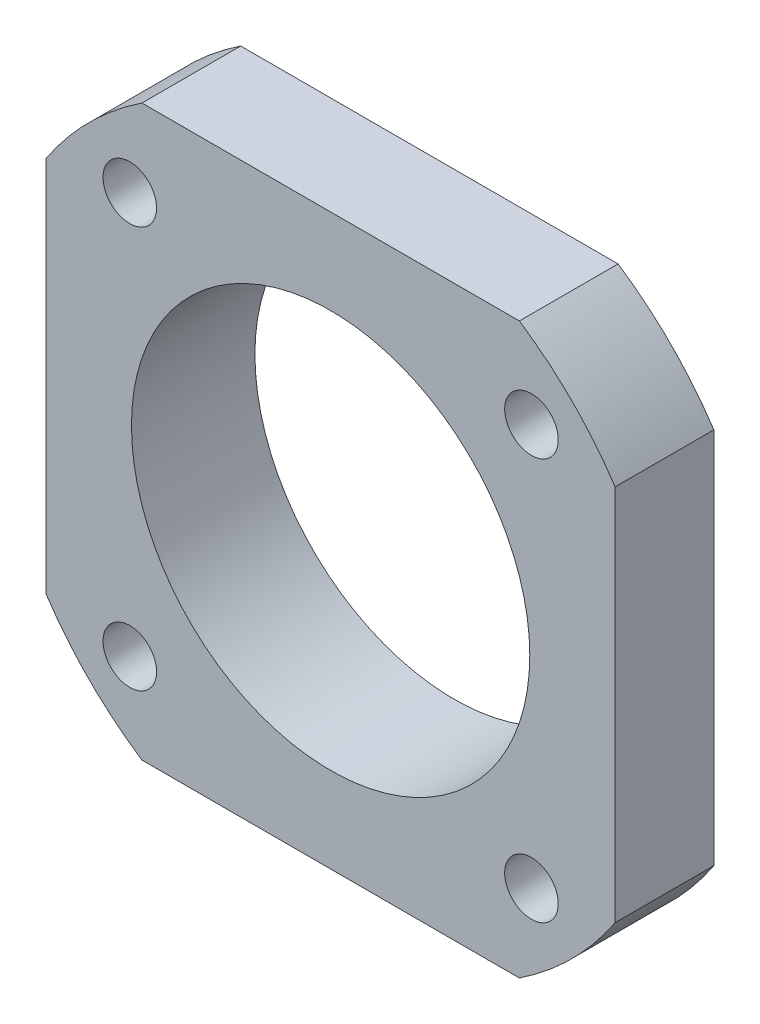
ISO-10303-21;
HEADER;
FILE_DESCRIPTION(('STEP AP214'),'2;1');
FILE_NAME('part.step','',(''),(''),'','','');
FILE_SCHEMA(('AUTOMOTIVE_DESIGN { 1 0 10303 214 1 1 1 1 }'));
ENDSEC;
DATA;
#1=APPLICATION_CONTEXT('core data for automotive mechanical design processes');
#2=APPLICATION_PROTOCOL_DEFINITION('international standard','automotive_design',2000,#1);
#3=PRODUCT_CONTEXT('',#1,'mechanical');
#4=PRODUCT('Part','Part','',(#3));
#5=PRODUCT_RELATED_PRODUCT_CATEGORY('part','',(#4));
#6=PRODUCT_DEFINITION_FORMATION('','',#4);
#7=PRODUCT_DEFINITION_CONTEXT('part definition',#1,'design');
#8=PRODUCT_DEFINITION('design','',#6,#7);
#9=PRODUCT_DEFINITION_SHAPE('','',#8);
#10=(LENGTH_UNIT() NAMED_UNIT(*) SI_UNIT(.MILLI.,.METRE.));
#11=(NAMED_UNIT(*) PLANE_ANGLE_UNIT() SI_UNIT($,.RADIAN.));
#12=(NAMED_UNIT(*) SI_UNIT($,.STERADIAN.) SOLID_ANGLE_UNIT());
#13=UNCERTAINTY_MEASURE_WITH_UNIT(LENGTH_MEASURE(1.E-05),#10,'distance_accuracy_value','');
#14=(GEOMETRIC_REPRESENTATION_CONTEXT(3) GLOBAL_UNCERTAINTY_ASSIGNED_CONTEXT((#13)) GLOBAL_UNIT_ASSIGNED_CONTEXT((#10,
#11,#12)) REPRESENTATION_CONTEXT('',''));
#15=CARTESIAN_POINT('',(0.,0.,0.));
#16=DIRECTION('',(0.,0.,1.));
#17=DIRECTION('',(1.,0.,0.));
#18=AXIS2_PLACEMENT_3D('',#15,#16,#17);
#19=CARTESIAN_POINT('',(0.,0.,-1.475));
#20=DIRECTION('',(0.,0.,1.));
#21=DIRECTION('',(1.,0.,0.));
#22=AXIS2_PLACEMENT_3D('',#19,#20,#21);
#23=CYLINDRICAL_SURFACE('',#22,12.75);
#24=CARTESIAN_POINT('',(0.,0.,-1.475));
#25=DIRECTION('',(0.,0.,1.));
#26=DIRECTION('',(1.,0.,0.));
#27=AXIS2_PLACEMENT_3D('',#24,#25,#26);
#28=CIRCLE('',#27,12.75);
#29=CARTESIAN_POINT('',(12.75,0.,-1.475));
#30=VERTEX_POINT('',#29);
#31=EDGE_CURVE('E19',#30,#30,#28,.F.);
#32=ORIENTED_EDGE('',*,*,#31,.F.);
#33=EDGE_LOOP('',(#32));
#34=FACE_BOUND('',#33,.T.);
#35=CARTESIAN_POINT('',(0.,0.,0.));
#36=DIRECTION('',(0.,0.,1.));
#37=DIRECTION('',(1.,0.,0.));
#38=AXIS2_PLACEMENT_3D('',#35,#36,#37);
#39=CIRCLE('',#38,12.75);
#40=CARTESIAN_POINT('',(12.75,0.,0.));
#41=VERTEX_POINT('',#40);
#42=EDGE_CURVE('E162',#41,#41,#39,.F.);
#43=ORIENTED_EDGE('',*,*,#42,.T.);
#44=EDGE_LOOP('',(#43));
#45=FACE_BOUND('',#44,.T.);
#46=ADVANCED_FACE('F16',(#34,#45),#23,.T.);
#47=CARTESIAN_POINT('',(0.,0.,-1.475));
#48=DIRECTION('',(0.,0.,-1.));
#49=DIRECTION('',(-1.,0.,0.));
#50=AXIS2_PLACEMENT_3D('',#47,#48,#49);
#51=PLANE('',#50);
#52=CARTESIAN_POINT('',(0.,0.,-1.475));
#53=DIRECTION('',(0.,0.,1.));
#54=DIRECTION('',(1.,0.,0.));
#55=AXIS2_PLACEMENT_3D('',#52,#53,#54);
#56=CIRCLE('',#55,11.9);
#57=CARTESIAN_POINT('',(11.9,0.,-1.475));
#58=VERTEX_POINT('',#57);
#59=EDGE_CURVE('E90',#58,#58,#56,.T.);
#60=ORIENTED_EDGE('',*,*,#59,.T.);
#61=EDGE_LOOP('',(#60));
#62=FACE_BOUND('',#61,.T.);
#63=ORIENTED_EDGE('',*,*,#31,.T.);
#64=EDGE_LOOP('',(#63));
#65=FACE_BOUND('',#64,.T.);
#66=ADVANCED_FACE('F169',(#62,#65),#51,.T.);
#67=CARTESIAN_POINT('',(0.,0.,0.));
#68=DIRECTION('',(0.,0.,1.));
#69=DIRECTION('',(1.,0.,0.));
#70=AXIS2_PLACEMENT_3D('',#67,#68,#69);
#71=PLANE('',#70);
#72=ORIENTED_EDGE('',*,*,#42,.F.);
#73=EDGE_LOOP('',(#72));
#74=FACE_BOUND('',#73,.T.);
#75=DIRECTION('',(1.,0.,0.));
#76=VECTOR('',#75,1.);
#77=CARTESIAN_POINT('',(11.2765242872084,-17.,0.));
#78=LINE('',#77,#76);
#79=CARTESIAN_POINT('',(11.2765242872083,-17.,0.));
#80=VERTEX_POINT('',#79);
#81=CARTESIAN_POINT('',(-11.2765242872084,-17.,0.));
#82=VERTEX_POINT('',#81);
#83=EDGE_CURVE('E84',#80,#82,#78,.F.);
#84=ORIENTED_EDGE('',*,*,#83,.T.);
#85=CARTESIAN_POINT('',(0.,0.,0.));
#86=DIRECTION('',(0.,0.,-1.));
#87=DIRECTION('',(-1.,0.,0.));
#88=AXIS2_PLACEMENT_3D('',#85,#86,#87);
#89=CIRCLE('',#88,20.4);
#90=CARTESIAN_POINT('',(-17.,-11.2765242872084,0.));
#91=VERTEX_POINT('',#90);
#92=EDGE_CURVE('E111',#91,#82,#89,.F.);
#93=ORIENTED_EDGE('',*,*,#92,.F.);
#94=DIRECTION('',(0.,1.,0.));
#95=VECTOR('',#94,1.);
#96=CARTESIAN_POINT('',(-17.,-11.2765242872084,0.));
#97=LINE('',#96,#95);
#98=CARTESIAN_POINT('',(-17.,11.2765242872084,0.));
#99=VERTEX_POINT('',#98);
#100=EDGE_CURVE('E108',#91,#99,#97,.T.);
#101=ORIENTED_EDGE('',*,*,#100,.T.);
#102=CARTESIAN_POINT('',(0.,0.,0.));
#103=DIRECTION('',(0.,0.,-1.));
#104=DIRECTION('',(-1.,0.,0.));
#105=AXIS2_PLACEMENT_3D('',#102,#103,#104);
#106=CIRCLE('',#105,20.4);
#107=CARTESIAN_POINT('',(-11.2765242872084,17.,0.));
#108=VERTEX_POINT('',#107);
#109=EDGE_CURVE('E116',#108,#99,#106,.F.);
#110=ORIENTED_EDGE('',*,*,#109,.F.);
#111=DIRECTION('',(1.,0.,0.));
#112=VECTOR('',#111,1.);
#113=CARTESIAN_POINT('',(-11.2765242872084,17.,0.));
#114=LINE('',#113,#112);
#115=CARTESIAN_POINT('',(11.2765242872083,17.,0.));
#116=VERTEX_POINT('',#115);
#117=EDGE_CURVE('E113',#108,#116,#114,.T.);
#118=ORIENTED_EDGE('',*,*,#117,.T.);
#119=CARTESIAN_POINT('',(0.,0.,0.));
#120=DIRECTION('',(0.,0.,-1.));
#121=DIRECTION('',(-1.,0.,0.));
#122=AXIS2_PLACEMENT_3D('',#119,#120,#121);
#123=CIRCLE('',#122,20.4);
#124=CARTESIAN_POINT('',(17.,11.2765242872083,0.));
#125=VERTEX_POINT('',#124);
#126=EDGE_CURVE('E119',#125,#116,#123,.F.);
#127=ORIENTED_EDGE('',*,*,#126,.F.);
#128=DIRECTION('',(0.,1.,0.));
#129=VECTOR('',#128,1.);
#130=CARTESIAN_POINT('',(17.,11.2765242872083,0.));
#131=LINE('',#130,#129);
#132=CARTESIAN_POINT('',(17.,-11.2765242872083,0.));
#133=VERTEX_POINT('',#132);
#134=EDGE_CURVE('E86',#125,#133,#131,.F.);
#135=ORIENTED_EDGE('',*,*,#134,.T.);
#136=CARTESIAN_POINT('',(0.,0.,0.));
#137=DIRECTION('',(0.,0.,-1.));
#138=DIRECTION('',(-1.,0.,0.));
#139=AXIS2_PLACEMENT_3D('',#136,#137,#138);
#140=CIRCLE('',#139,20.4);
#141=EDGE_CURVE('E79',#80,#133,#140,.F.);
#142=ORIENTED_EDGE('',*,*,#141,.F.);
#143=EDGE_LOOP('',(#84,#93,#101,#110,#118,#127,#135,#142));
#144=FACE_BOUND('',#143,.T.);
#145=CARTESIAN_POINT('',(12.,-12.,0.));
#146=DIRECTION('',(0.,0.,1.));
#147=DIRECTION('',(1.,0.,0.));
#148=AXIS2_PLACEMENT_3D('',#145,#146,#147);
#149=CIRCLE('',#148,1.6);
#150=CARTESIAN_POINT('',(13.6,-12.,0.));
#151=VERTEX_POINT('',#150);
#152=EDGE_CURVE('E151',#151,#151,#149,.T.);
#153=ORIENTED_EDGE('',*,*,#152,.T.);
#154=EDGE_LOOP('',(#153));
#155=FACE_BOUND('',#154,.T.);
#156=CARTESIAN_POINT('',(12.,12.,0.));
#157=DIRECTION('',(0.,0.,1.));
#158=DIRECTION('',(1.,0.,0.));
#159=AXIS2_PLACEMENT_3D('',#156,#157,#158);
#160=CIRCLE('',#159,1.6);
#161=CARTESIAN_POINT('',(13.6,12.,0.));
#162=VERTEX_POINT('',#161);
#163=EDGE_CURVE('E154',#162,#162,#160,.T.);
#164=ORIENTED_EDGE('',*,*,#163,.T.);
#165=EDGE_LOOP('',(#164));
#166=FACE_BOUND('',#165,.T.);
#167=CARTESIAN_POINT('',(-12.,12.,0.));
#168=DIRECTION('',(0.,0.,1.));
#169=DIRECTION('',(1.,0.,0.));
#170=AXIS2_PLACEMENT_3D('',#167,#168,#169);
#171=CIRCLE('',#170,1.6);
#172=CARTESIAN_POINT('',(-10.4,12.,0.));
#173=VERTEX_POINT('',#172);
#174=EDGE_CURVE('E157',#173,#173,#171,.T.);
#175=ORIENTED_EDGE('',*,*,#174,.T.);
#176=EDGE_LOOP('',(#175));
#177=FACE_BOUND('',#176,.T.);
#178=CARTESIAN_POINT('',(-12.,-12.,0.));
#179=DIRECTION('',(0.,0.,1.));
#180=DIRECTION('',(1.,0.,0.));
#181=AXIS2_PLACEMENT_3D('',#178,#179,#180);
#182=CIRCLE('',#181,1.6);
#183=CARTESIAN_POINT('',(-10.4,-12.,0.));
#184=VERTEX_POINT('',#183);
#185=EDGE_CURVE('E160',#184,#184,#182,.T.);
#186=ORIENTED_EDGE('',*,*,#185,.T.);
#187=EDGE_LOOP('',(#186));
#188=FACE_BOUND('',#187,.T.);
#189=ADVANCED_FACE('F81',(#74,#144,#155,#166,#177,#188),#71,.F.);
#190=CARTESIAN_POINT('',(-12.,-12.,-1.476));
#191=DIRECTION('',(0.,0.,1.));
#192=DIRECTION('',(1.,0.,0.));
#193=AXIS2_PLACEMENT_3D('',#190,#191,#192);
#194=CYLINDRICAL_SURFACE('',#193,1.6);
#195=CARTESIAN_POINT('',(-12.,-12.,5.9));
#196=DIRECTION('',(0.,0.,1.));
#197=DIRECTION('',(1.,0.,0.));
#198=AXIS2_PLACEMENT_3D('',#195,#196,#197);
#199=CIRCLE('',#198,1.6);
#200=CARTESIAN_POINT('',(-10.4,-12.,5.9));
#201=VERTEX_POINT('',#200);
#202=EDGE_CURVE('E100',#201,#201,#199,.F.);
#203=ORIENTED_EDGE('',*,*,#202,.F.);
#204=EDGE_LOOP('',(#203));
#205=FACE_BOUND('',#204,.T.);
#206=ORIENTED_EDGE('',*,*,#185,.F.);
#207=EDGE_LOOP('',(#206));
#208=FACE_BOUND('',#207,.T.);
#209=ADVANCED_FACE('F227',(#205,#208),#194,.F.);
#210=CARTESIAN_POINT('',(-12.,12.,-1.476));
#211=DIRECTION('',(0.,0.,1.));
#212=DIRECTION('',(1.,0.,0.));
#213=AXIS2_PLACEMENT_3D('',#210,#211,#212);
#214=CYLINDRICAL_SURFACE('',#213,1.6);
#215=CARTESIAN_POINT('',(-12.,12.,5.9));
#216=DIRECTION('',(0.,0.,1.));
#217=DIRECTION('',(1.,0.,0.));
#218=AXIS2_PLACEMENT_3D('',#215,#216,#217);
#219=CIRCLE('',#218,1.6);
#220=CARTESIAN_POINT('',(-10.4,12.,5.9));
#221=VERTEX_POINT('',#220);
#222=EDGE_CURVE('E103',#221,#221,#219,.F.);
#223=ORIENTED_EDGE('',*,*,#222,.F.);
#224=EDGE_LOOP('',(#223));
#225=FACE_BOUND('',#224,.T.);
#226=ORIENTED_EDGE('',*,*,#174,.F.);
#227=EDGE_LOOP('',(#226));
#228=FACE_BOUND('',#227,.T.);
#229=ADVANCED_FACE('F223',(#225,#228),#214,.F.);
#230=CARTESIAN_POINT('',(12.,12.,-1.476));
#231=DIRECTION('',(0.,0.,1.));
#232=DIRECTION('',(1.,0.,0.));
#233=AXIS2_PLACEMENT_3D('',#230,#231,#232);
#234=CYLINDRICAL_SURFACE('',#233,1.6);
#235=CARTESIAN_POINT('',(12.,12.,5.9));
#236=DIRECTION('',(0.,0.,1.));
#237=DIRECTION('',(1.,0.,0.));
#238=AXIS2_PLACEMENT_3D('',#235,#236,#237);
#239=CIRCLE('',#238,1.6);
#240=CARTESIAN_POINT('',(13.6,12.,5.9));
#241=VERTEX_POINT('',#240);
#242=EDGE_CURVE('E138',#241,#241,#239,.F.);
#243=ORIENTED_EDGE('',*,*,#242,.F.);
#244=EDGE_LOOP('',(#243));
#245=FACE_BOUND('',#244,.T.);
#246=ORIENTED_EDGE('',*,*,#163,.F.);
#247=EDGE_LOOP('',(#246));
#248=FACE_BOUND('',#247,.T.);
#249=ADVANCED_FACE('F219',(#245,#248),#234,.F.);
#250=CARTESIAN_POINT('',(12.,-12.,-1.476));
#251=DIRECTION('',(0.,0.,1.));
#252=DIRECTION('',(1.,0.,0.));
#253=AXIS2_PLACEMENT_3D('',#250,#251,#252);
#254=CYLINDRICAL_SURFACE('',#253,1.6);
#255=CARTESIAN_POINT('',(12.,-12.,5.9));
#256=DIRECTION('',(0.,0.,1.));
#257=DIRECTION('',(1.,0.,0.));
#258=AXIS2_PLACEMENT_3D('',#255,#256,#257);
#259=CIRCLE('',#258,1.6);
#260=CARTESIAN_POINT('',(13.6,-12.,5.9));
#261=VERTEX_POINT('',#260);
#262=EDGE_CURVE('E135',#261,#261,#259,.F.);
#263=ORIENTED_EDGE('',*,*,#262,.F.);
#264=EDGE_LOOP('',(#263));
#265=FACE_BOUND('',#264,.T.);
#266=ORIENTED_EDGE('',*,*,#152,.F.);
#267=EDGE_LOOP('',(#266));
#268=FACE_BOUND('',#267,.T.);
#269=ADVANCED_FACE('F215',(#265,#268),#254,.F.);
#270=CARTESIAN_POINT('',(0.,0.,-0.00100000000000013));
#271=DIRECTION('',(0.,0.,1.));
#272=DIRECTION('',(1.,0.,0.));
#273=AXIS2_PLACEMENT_3D('',#270,#271,#272);
#274=CYLINDRICAL_SURFACE('',#273,11.9);
#275=CARTESIAN_POINT('',(0.,0.,5.9));
#276=DIRECTION('',(0.,0.,1.));
#277=DIRECTION('',(1.,0.,0.));
#278=AXIS2_PLACEMENT_3D('',#275,#276,#277);
#279=CIRCLE('',#278,11.9);
#280=CARTESIAN_POINT('',(11.9,0.,5.9));
#281=VERTEX_POINT('',#280);
#282=EDGE_CURVE('E132',#281,#281,#279,.F.);
#283=ORIENTED_EDGE('',*,*,#282,.F.);
#284=EDGE_LOOP('',(#283));
#285=FACE_BOUND('',#284,.T.);
#286=ORIENTED_EDGE('',*,*,#59,.F.);
#287=EDGE_LOOP('',(#286));
#288=FACE_BOUND('',#287,.T.);
#289=ADVANCED_FACE('F212',(#285,#288),#274,.F.);
#290=CARTESIAN_POINT('',(0.,0.,5.9));
#291=DIRECTION('',(0.,0.,-1.));
#292=DIRECTION('',(-1.,0.,0.));
#293=AXIS2_PLACEMENT_3D('',#290,#291,#292);
#294=CYLINDRICAL_SURFACE('',#293,20.4);
#295=CARTESIAN_POINT('',(0.,0.,5.9));
#296=DIRECTION('',(0.,0.,-1.));
#297=DIRECTION('',(-1.,0.,0.));
#298=AXIS2_PLACEMENT_3D('',#295,#296,#297);
#299=CIRCLE('',#298,20.4);
#300=CARTESIAN_POINT('',(11.2765242872084,-17.,5.9));
#301=VERTEX_POINT('',#300);
#302=CARTESIAN_POINT('',(17.,-11.2765242872083,5.9));
#303=VERTEX_POINT('',#302);
#304=EDGE_CURVE('E96',#301,#303,#299,.F.);
#305=ORIENTED_EDGE('',*,*,#304,.F.);
#306=DIRECTION('',(0.,0.,1.));
#307=VECTOR('',#306,1.);
#308=CARTESIAN_POINT('',(11.2765242872084,-17.,5.9));
#309=LINE('',#308,#307);
#310=EDGE_CURVE('E93',#301,#80,#309,.F.);
#311=ORIENTED_EDGE('',*,*,#310,.T.);
#312=ORIENTED_EDGE('',*,*,#141,.T.);
#313=DIRECTION('',(0.,0.,1.));
#314=VECTOR('',#313,1.);
#315=CARTESIAN_POINT('',(17.,-11.2765242872083,5.9));
#316=LINE('',#315,#314);
#317=EDGE_CURVE('E89',#133,#303,#316,.T.);
#318=ORIENTED_EDGE('',*,*,#317,.T.);
#319=EDGE_LOOP('',(#305,#311,#312,#318));
#320=FACE_BOUND('',#319,.T.);
#321=ADVANCED_FACE('F94',(#320),#294,.T.);
#322=CARTESIAN_POINT('',(17.,11.2765242872083,5.9));
#323=DIRECTION('',(-1.,0.,0.));
#324=DIRECTION('',(0.,0.,1.));
#325=AXIS2_PLACEMENT_3D('',#322,#323,#324);
#326=PLANE('',#325);
#327=DIRECTION('',(0.,0.,-1.));
#328=VECTOR('',#327,1.);
#329=CARTESIAN_POINT('',(17.,11.2765242872083,5.9));
#330=LINE('',#329,#328);
#331=CARTESIAN_POINT('',(17.,11.2765242872083,5.9));
#332=VERTEX_POINT('',#331);
#333=EDGE_CURVE('E147',#332,#125,#330,.T.);
#334=ORIENTED_EDGE('',*,*,#333,.F.);
#335=DIRECTION('',(0.,1.,0.));
#336=VECTOR('',#335,1.);
#337=CARTESIAN_POINT('',(17.,0.,5.9));
#338=LINE('',#337,#336);
#339=EDGE_CURVE('E130',#303,#332,#338,.T.);
#340=ORIENTED_EDGE('',*,*,#339,.F.);
#341=ORIENTED_EDGE('',*,*,#317,.F.);
#342=ORIENTED_EDGE('',*,*,#134,.F.);
#343=EDGE_LOOP('',(#334,#340,#341,#342));
#344=FACE_BOUND('',#343,.T.);
#345=ADVANCED_FACE('F205',(#344),#326,.F.);
#346=CARTESIAN_POINT('',(0.,0.,5.9));
#347=DIRECTION('',(0.,0.,-1.));
#348=DIRECTION('',(-1.,0.,0.));
#349=AXIS2_PLACEMENT_3D('',#346,#347,#348);
#350=CYLINDRICAL_SURFACE('',#349,20.4);
#351=CARTESIAN_POINT('',(0.,0.,5.9));
#352=DIRECTION('',(0.,0.,-1.));
#353=DIRECTION('',(-1.,0.,0.));
#354=AXIS2_PLACEMENT_3D('',#351,#352,#353);
#355=CIRCLE('',#354,20.4);
#356=CARTESIAN_POINT('',(11.2765242872084,17.,5.9));
#357=VERTEX_POINT('',#356);
#358=EDGE_CURVE('E127',#332,#357,#355,.F.);
#359=ORIENTED_EDGE('',*,*,#358,.F.);
#360=ORIENTED_EDGE('',*,*,#333,.T.);
#361=ORIENTED_EDGE('',*,*,#126,.T.);
#362=DIRECTION('',(0.,0.,-1.));
#363=VECTOR('',#362,1.);
#364=CARTESIAN_POINT('',(11.2765242872083,17.,5.9));
#365=LINE('',#364,#363);
#366=EDGE_CURVE('E117',#116,#357,#365,.F.);
#367=ORIENTED_EDGE('',*,*,#366,.T.);
#368=EDGE_LOOP('',(#359,#360,#361,#367));
#369=FACE_BOUND('',#368,.T.);
#370=ADVANCED_FACE('F201',(#369),#350,.T.);
#371=CARTESIAN_POINT('',(-11.2765242872084,17.,5.9));
#372=DIRECTION('',(0.,-1.,0.));
#373=DIRECTION('',(0.,0.,-1.));
#374=AXIS2_PLACEMENT_3D('',#371,#372,#373);
#375=PLANE('',#374);
#376=DIRECTION('',(0.,0.,-1.));
#377=VECTOR('',#376,1.);
#378=CARTESIAN_POINT('',(-11.2765242872084,17.,5.9));
#379=LINE('',#378,#377);
#380=CARTESIAN_POINT('',(-11.2765242872084,17.,5.9));
#381=VERTEX_POINT('',#380);
#382=EDGE_CURVE('E146',#381,#108,#379,.T.);
#383=ORIENTED_EDGE('',*,*,#382,.F.);
#384=DIRECTION('',(1.,0.,0.));
#385=VECTOR('',#384,1.);
#386=CARTESIAN_POINT('',(0.,17.,5.9));
#387=LINE('',#386,#385);
#388=EDGE_CURVE('E126',#357,#381,#387,.F.);
#389=ORIENTED_EDGE('',*,*,#388,.F.);
#390=ORIENTED_EDGE('',*,*,#366,.F.);
#391=ORIENTED_EDGE('',*,*,#117,.F.);
#392=EDGE_LOOP('',(#383,#389,#390,#391));
#393=FACE_BOUND('',#392,.T.);
#394=ADVANCED_FACE('F197',(#393),#375,.F.);
#395=CARTESIAN_POINT('',(0.,0.,5.9));
#396=DIRECTION('',(0.,0.,-1.));
#397=DIRECTION('',(-1.,0.,0.));
#398=AXIS2_PLACEMENT_3D('',#395,#396,#397);
#399=CYLINDRICAL_SURFACE('',#398,20.4);
#400=CARTESIAN_POINT('',(0.,0.,5.9));
#401=DIRECTION('',(0.,0.,-1.));
#402=DIRECTION('',(-1.,0.,0.));
#403=AXIS2_PLACEMENT_3D('',#400,#401,#402);
#404=CIRCLE('',#403,20.4);
#405=CARTESIAN_POINT('',(-17.,11.2765242872084,5.9));
#406=VERTEX_POINT('',#405);
#407=EDGE_CURVE('E123',#381,#406,#404,.F.);
#408=ORIENTED_EDGE('',*,*,#407,.F.);
#409=ORIENTED_EDGE('',*,*,#382,.T.);
#410=ORIENTED_EDGE('',*,*,#109,.T.);
#411=DIRECTION('',(0.,0.,-1.));
#412=VECTOR('',#411,1.);
#413=CARTESIAN_POINT('',(-17.,11.2765242872084,5.9));
#414=LINE('',#413,#412);
#415=EDGE_CURVE('E112',#99,#406,#414,.F.);
#416=ORIENTED_EDGE('',*,*,#415,.T.);
#417=EDGE_LOOP('',(#408,#409,#410,#416));
#418=FACE_BOUND('',#417,.T.);
#419=ADVANCED_FACE('F193',(#418),#399,.T.);
#420=CARTESIAN_POINT('',(-17.,-11.2765242872084,5.9));
#421=DIRECTION('',(1.,0.,0.));
#422=DIRECTION('',(0.,0.,-1.));
#423=AXIS2_PLACEMENT_3D('',#420,#421,#422);
#424=PLANE('',#423);
#425=DIRECTION('',(0.,0.,-1.));
#426=VECTOR('',#425,1.);
#427=CARTESIAN_POINT('',(-17.,-11.2765242872084,5.9));
#428=LINE('',#427,#426);
#429=CARTESIAN_POINT('',(-17.,-11.2765242872084,5.9));
#430=VERTEX_POINT('',#429);
#431=EDGE_CURVE('E144',#430,#91,#428,.T.);
#432=ORIENTED_EDGE('',*,*,#431,.F.);
#433=DIRECTION('',(0.,1.,0.));
#434=VECTOR('',#433,1.);
#435=CARTESIAN_POINT('',(-17.,0.,5.9));
#436=LINE('',#435,#434);
#437=EDGE_CURVE('E122',#406,#430,#436,.F.);
#438=ORIENTED_EDGE('',*,*,#437,.F.);
#439=ORIENTED_EDGE('',*,*,#415,.F.);
#440=ORIENTED_EDGE('',*,*,#100,.F.);
#441=EDGE_LOOP('',(#432,#438,#439,#440));
#442=FACE_BOUND('',#441,.T.);
#443=ADVANCED_FACE('F190',(#442),#424,.F.);
#444=CARTESIAN_POINT('',(0.,0.,5.9));
#445=DIRECTION('',(0.,0.,-1.));
#446=DIRECTION('',(-1.,0.,0.));
#447=AXIS2_PLACEMENT_3D('',#444,#445,#446);
#448=CYLINDRICAL_SURFACE('',#447,20.4);
#449=CARTESIAN_POINT('',(0.,0.,5.9));
#450=DIRECTION('',(0.,0.,-1.));
#451=DIRECTION('',(-1.,0.,0.));
#452=AXIS2_PLACEMENT_3D('',#449,#450,#451);
#453=CIRCLE('',#452,20.4);
#454=CARTESIAN_POINT('',(-11.2765242872084,-17.,5.9));
#455=VERTEX_POINT('',#454);
#456=EDGE_CURVE('E25',#430,#455,#453,.F.);
#457=ORIENTED_EDGE('',*,*,#456,.F.);
#458=ORIENTED_EDGE('',*,*,#431,.T.);
#459=ORIENTED_EDGE('',*,*,#92,.T.);
#460=DIRECTION('',(0.,0.,1.));
#461=VECTOR('',#460,1.);
#462=CARTESIAN_POINT('',(-11.2765242872084,-17.,5.9));
#463=LINE('',#462,#461);
#464=EDGE_CURVE('E34',#82,#455,#463,.T.);
#465=ORIENTED_EDGE('',*,*,#464,.T.);
#466=EDGE_LOOP('',(#457,#458,#459,#465));
#467=FACE_BOUND('',#466,.T.);
#468=ADVANCED_FACE('F184',(#467),#448,.T.);
#469=CARTESIAN_POINT('',(11.2765242872084,-17.,5.9));
#470=DIRECTION('',(0.,1.,0.));
#471=DIRECTION('',(0.,0.,1.));
#472=AXIS2_PLACEMENT_3D('',#469,#470,#471);
#473=PLANE('',#472);
#474=ORIENTED_EDGE('',*,*,#310,.F.);
#475=DIRECTION('',(1.,0.,0.));
#476=VECTOR('',#475,1.);
#477=CARTESIAN_POINT('',(0.,-17.,5.9));
#478=LINE('',#477,#476);
#479=EDGE_CURVE('E10',#455,#301,#478,.T.);
#480=ORIENTED_EDGE('',*,*,#479,.F.);
#481=ORIENTED_EDGE('',*,*,#464,.F.);
#482=ORIENTED_EDGE('',*,*,#83,.F.);
#483=EDGE_LOOP('',(#474,#480,#481,#482));
#484=FACE_BOUND('',#483,.T.);
#485=ADVANCED_FACE('F99',(#484),#473,.F.);
#486=CARTESIAN_POINT('',(0.,0.,5.9));
#487=DIRECTION('',(0.,0.,1.));
#488=DIRECTION('',(1.,0.,0.));
#489=AXIS2_PLACEMENT_3D('',#486,#487,#488);
#490=PLANE('',#489);
#491=ORIENTED_EDGE('',*,*,#456,.T.);
#492=ORIENTED_EDGE('',*,*,#479,.T.);
#493=ORIENTED_EDGE('',*,*,#304,.T.);
#494=ORIENTED_EDGE('',*,*,#339,.T.);
#495=ORIENTED_EDGE('',*,*,#358,.T.);
#496=ORIENTED_EDGE('',*,*,#388,.T.);
#497=ORIENTED_EDGE('',*,*,#407,.T.);
#498=ORIENTED_EDGE('',*,*,#437,.T.);
#499=EDGE_LOOP('',(#491,#492,#493,#494,#495,#496,#497,#498));
#500=FACE_BOUND('',#499,.T.);
#501=ORIENTED_EDGE('',*,*,#282,.T.);
#502=EDGE_LOOP('',(#501));
#503=FACE_BOUND('',#502,.T.);
#504=ORIENTED_EDGE('',*,*,#262,.T.);
#505=EDGE_LOOP('',(#504));
#506=FACE_BOUND('',#505,.T.);
#507=ORIENTED_EDGE('',*,*,#242,.T.);
#508=EDGE_LOOP('',(#507));
#509=FACE_BOUND('',#508,.T.);
#510=ORIENTED_EDGE('',*,*,#222,.T.);
#511=EDGE_LOOP('',(#510));
#512=FACE_BOUND('',#511,.T.);
#513=ORIENTED_EDGE('',*,*,#202,.T.);
#514=EDGE_LOOP('',(#513));
#515=FACE_BOUND('',#514,.T.);
#516=ADVANCED_FACE('F177',(#500,#503,#506,#509,#512,#515),#490,.T.);
#517=CLOSED_SHELL('',(#46,#66,#189,#209,#229,#249,#269,#289,#321,#345,#370,#394,#419,#443,#468,
#485,#516));
#518=MANIFOLD_SOLID_BREP('B1',#517);
#519=ADVANCED_BREP_SHAPE_REPRESENTATION('',(#18,#518),#14);
#520=SHAPE_DEFINITION_REPRESENTATION(#9,#519);
ENDSEC;
END-ISO-10303-21;
